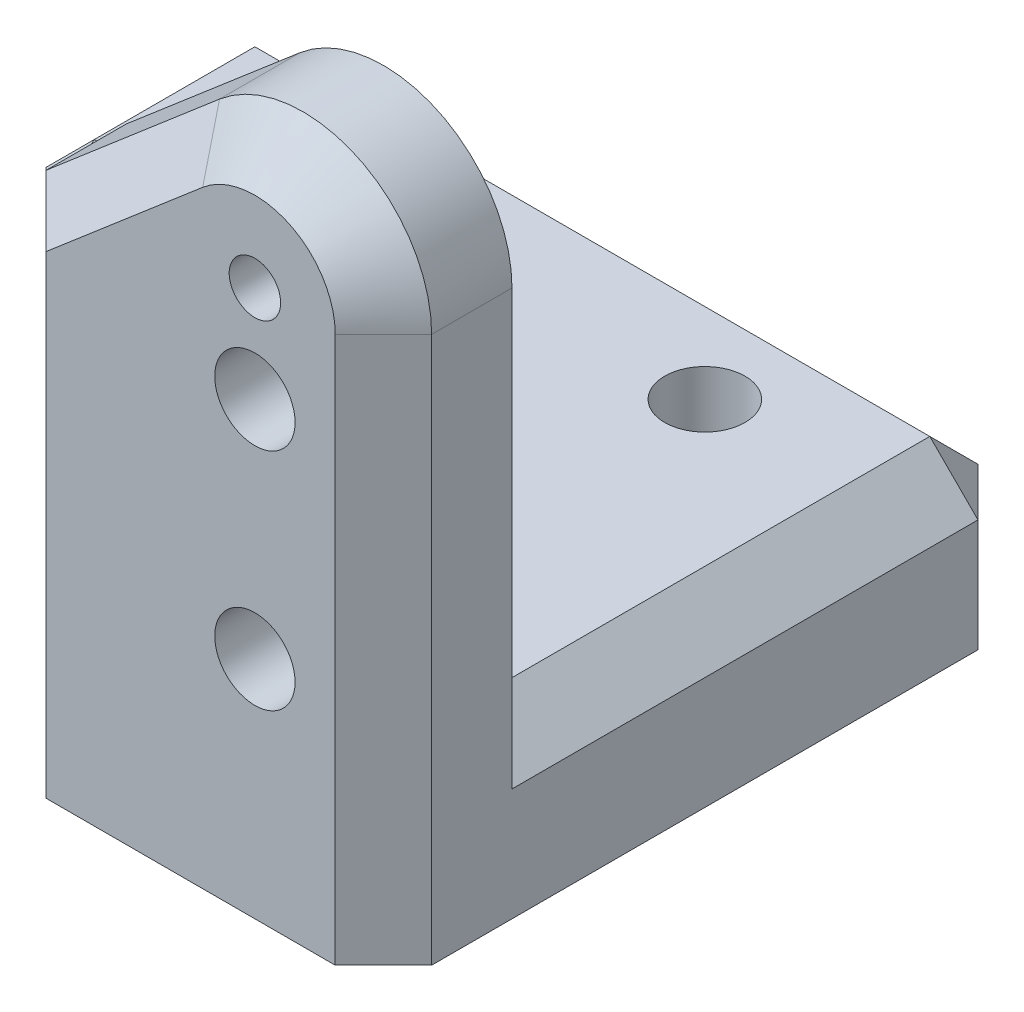
ISO-10303-21;
HEADER;
FILE_DESCRIPTION(('STEP AP214'),'2;1');
FILE_NAME('part.step','',(''),(''),'','','');
FILE_SCHEMA(('AUTOMOTIVE_DESIGN { 1 0 10303 214 1 1 1 1 }'));
ENDSEC;
DATA;
#1=APPLICATION_CONTEXT('core data for automotive mechanical design processes');
#2=APPLICATION_PROTOCOL_DEFINITION('international standard','automotive_design',2000,#1);
#3=PRODUCT_CONTEXT('',#1,'mechanical');
#4=PRODUCT('Part','Part','',(#3));
#5=PRODUCT_RELATED_PRODUCT_CATEGORY('part','',(#4));
#6=PRODUCT_DEFINITION_FORMATION('','',#4);
#7=PRODUCT_DEFINITION_CONTEXT('part definition',#1,'design');
#8=PRODUCT_DEFINITION('design','',#6,#7);
#9=PRODUCT_DEFINITION_SHAPE('','',#8);
#10=(LENGTH_UNIT() NAMED_UNIT(*) SI_UNIT(.MILLI.,.METRE.));
#11=(NAMED_UNIT(*) PLANE_ANGLE_UNIT() SI_UNIT($,.RADIAN.));
#12=(NAMED_UNIT(*) SI_UNIT($,.STERADIAN.) SOLID_ANGLE_UNIT());
#13=UNCERTAINTY_MEASURE_WITH_UNIT(LENGTH_MEASURE(1.E-05),#10,'distance_accuracy_value','');
#14=(GEOMETRIC_REPRESENTATION_CONTEXT(3) GLOBAL_UNCERTAINTY_ASSIGNED_CONTEXT((#13)) GLOBAL_UNIT_ASSIGNED_CONTEXT((#10,
#11,#12)) REPRESENTATION_CONTEXT('',''));
#15=CARTESIAN_POINT('',(0.,0.,0.));
#16=DIRECTION('',(0.,0.,1.));
#17=DIRECTION('',(1.,0.,0.));
#18=AXIS2_PLACEMENT_3D('',#15,#16,#17);
#19=CARTESIAN_POINT('',(-4.,5.,0.));
#20=DIRECTION('',(0.,-1.,0.));
#21=DIRECTION('',(0.,0.,-1.));
#22=AXIS2_PLACEMENT_3D('',#19,#20,#21);
#23=PLANE('',#22);
#24=CARTESIAN_POINT('',(-2.,5.,4.00000000000001));
#25=DIRECTION('',(0.,-1.,0.));
#26=DIRECTION('',(0.,0.,-1.));
#27=AXIS2_PLACEMENT_3D('',#24,#25,#26);
#28=CIRCLE('',#27,1.25);
#29=CARTESIAN_POINT('',(-2.,5.,2.75000000000001));
#30=VERTEX_POINT('',#29);
#31=EDGE_CURVE('E939',#30,#30,#28,.T.);
#32=ORIENTED_EDGE('',*,*,#31,.T.);
#33=EDGE_LOOP('',(#32));
#34=FACE_BOUND('',#33,.T.);
#35=CARTESIAN_POINT('',(10.,5.,4.00000000000001));
#36=DIRECTION('',(0.,-1.,0.));
#37=DIRECTION('',(0.,0.,-1.));
#38=AXIS2_PLACEMENT_3D('',#35,#36,#37);
#39=CIRCLE('',#38,1.25);
#40=CARTESIAN_POINT('',(10.,5.,2.75000000000001));
#41=VERTEX_POINT('',#40);
#42=EDGE_CURVE('E946',#41,#41,#39,.T.);
#43=ORIENTED_EDGE('',*,*,#42,.T.);
#44=EDGE_LOOP('',(#43));
#45=FACE_BOUND('',#44,.T.);
#46=CARTESIAN_POINT('',(10.,5.,14.));
#47=DIRECTION('',(0.,-1.,0.));
#48=DIRECTION('',(0.,0.,-1.));
#49=AXIS2_PLACEMENT_3D('',#46,#47,#48);
#50=CIRCLE('',#49,1.25);
#51=CARTESIAN_POINT('',(10.,5.,12.75));
#52=VERTEX_POINT('',#51);
#53=EDGE_CURVE('E273',#52,#52,#50,.T.);
#54=ORIENTED_EDGE('',*,*,#53,.T.);
#55=EDGE_LOOP('',(#54));
#56=FACE_BOUND('',#55,.T.);
#57=DIRECTION('',(1.,0.,0.));
#58=VECTOR('',#57,1.);
#59=CARTESIAN_POINT('',(-4.,5.,16.));
#60=LINE('',#59,#58);
#61=CARTESIAN_POINT('',(5.50000000000001,5.,16.));
#62=VERTEX_POINT('',#61);
#63=CARTESIAN_POINT('',(14.5,5.,16.));
#64=VERTEX_POINT('',#63);
#65=EDGE_CURVE('E347',#62,#64,#60,.T.);
#66=ORIENTED_EDGE('',*,*,#65,.T.);
#67=DIRECTION('',(0.,0.,-1.));
#68=VECTOR('',#67,1.);
#69=CARTESIAN_POINT('',(14.5,5.,0.));
#70=LINE('',#69,#68);
#71=CARTESIAN_POINT('',(14.5,5.,1.5));
#72=VERTEX_POINT('',#71);
#73=EDGE_CURVE('E212',#64,#72,#70,.T.);
#74=ORIENTED_EDGE('',*,*,#73,.T.);
#75=DIRECTION('',(-1.,0.,0.));
#76=VECTOR('',#75,1.);
#77=CARTESIAN_POINT('',(-8.,5.,1.5));
#78=LINE('',#77,#76);
#79=CARTESIAN_POINT('',(-6.50000000000001,5.,1.5));
#80=VERTEX_POINT('',#79);
#81=EDGE_CURVE('E209',#72,#80,#78,.T.);
#82=ORIENTED_EDGE('',*,*,#81,.T.);
#83=DIRECTION('',(0.,0.,1.));
#84=VECTOR('',#83,1.);
#85=CARTESIAN_POINT('',(-6.50000000000001,5.,0.));
#86=LINE('',#85,#84);
#87=CARTESIAN_POINT('',(-6.50000000000001,5.,6.50000000000001));
#88=VERTEX_POINT('',#87);
#89=EDGE_CURVE('E206',#80,#88,#86,.T.);
#90=ORIENTED_EDGE('',*,*,#89,.T.);
#91=DIRECTION('',(1.,0.,0.));
#92=VECTOR('',#91,1.);
#93=CARTESIAN_POINT('',(-4.,5.,6.50000000000001));
#94=LINE('',#93,#92);
#95=CARTESIAN_POINT('',(2.5,5.,6.50000000000001));
#96=VERTEX_POINT('',#95);
#97=EDGE_CURVE('E186',#88,#96,#94,.T.);
#98=ORIENTED_EDGE('',*,*,#97,.T.);
#99=DIRECTION('',(-0.707106781186551,0.,-0.707106781186544));
#100=VECTOR('',#99,1.);
#101=CARTESIAN_POINT('',(2.5,5.,6.50000000000001));
#102=LINE('',#101,#100);
#103=CARTESIAN_POINT('',(4.,5.,8.));
#104=VERTEX_POINT('',#103);
#105=EDGE_CURVE('E180',#104,#96,#102,.T.);
#106=ORIENTED_EDGE('',*,*,#105,.F.);
#107=DIRECTION('',(-0.707106781186551,0.,-0.707106781186544));
#108=VECTOR('',#107,1.);
#109=CARTESIAN_POINT('',(2.5,5.,6.50000000000001));
#110=LINE('',#109,#108);
#111=CARTESIAN_POINT('',(5.50000000000001,5.,9.49999999999999));
#112=VERTEX_POINT('',#111);
#113=EDGE_CURVE('E183',#112,#104,#110,.T.);
#114=ORIENTED_EDGE('',*,*,#113,.F.);
#115=DIRECTION('',(0.,0.,1.));
#116=VECTOR('',#115,1.);
#117=CARTESIAN_POINT('',(5.50000000000001,5.,0.));
#118=LINE('',#117,#116);
#119=EDGE_CURVE('E197',#112,#62,#118,.T.);
#120=ORIENTED_EDGE('',*,*,#119,.T.);
#121=EDGE_LOOP('',(#66,#74,#82,#90,#98,#106,#114,#120));
#122=FACE_BOUND('',#121,.T.);
#123=ADVANCED_FACE('F45',(#34,#45,#56,#122),#23,.F.);
#124=CARTESIAN_POINT('',(4.,0.,0.));
#125=DIRECTION('',(1.,0.,0.));
#126=DIRECTION('',(0.,0.,-1.));
#127=AXIS2_PLACEMENT_3D('',#124,#125,#126);
#128=PLANE('',#127);
#129=DIRECTION('',(0.,1.,0.));
#130=VECTOR('',#129,1.);
#131=CARTESIAN_POINT('',(4.,5.,16.));
#132=LINE('',#131,#130);
#133=CARTESIAN_POINT('',(4.,3.50000000000001,16.));
#134=VERTEX_POINT('',#133);
#135=CARTESIAN_POINT('',(4.,15.4211646096066,16.));
#136=VERTEX_POINT('',#135);
#137=EDGE_CURVE('E64',#134,#136,#132,.T.);
#138=ORIENTED_EDGE('',*,*,#137,.F.);
#139=DIRECTION('',(0.,0.,-1.));
#140=VECTOR('',#139,1.);
#141=CARTESIAN_POINT('',(4.,3.50000000000001,0.));
#142=LINE('',#141,#140);
#143=CARTESIAN_POINT('',(4.,3.50000000000001,9.49999999999999));
#144=VERTEX_POINT('',#143);
#145=EDGE_CURVE('E69',#134,#144,#142,.T.);
#146=ORIENTED_EDGE('',*,*,#145,.T.);
#147=DIRECTION('',(0.,-1.,0.));
#148=VECTOR('',#147,1.);
#149=CARTESIAN_POINT('',(4.,0.,9.49999999999999));
#150=LINE('',#149,#148);
#151=CARTESIAN_POINT('',(4.,0.,9.49999999999999));
#152=VERTEX_POINT('',#151);
#153=EDGE_CURVE('E259',#144,#152,#150,.T.);
#154=ORIENTED_EDGE('',*,*,#153,.T.);
#155=DIRECTION('',(0.,0.,1.));
#156=VECTOR('',#155,1.);
#157=CARTESIAN_POINT('',(4.,0.,0.));
#158=LINE('',#157,#156);
#159=CARTESIAN_POINT('',(4.,0.,18.5));
#160=VERTEX_POINT('',#159);
#161=EDGE_CURVE('E338',#152,#160,#158,.T.);
#162=ORIENTED_EDGE('',*,*,#161,.T.);
#163=DIRECTION('',(0.,1.,0.));
#164=VECTOR('',#163,1.);
#165=CARTESIAN_POINT('',(4.,0.,18.5));
#166=LINE('',#165,#164);
#167=CARTESIAN_POINT('',(4.,15.4211646096066,18.5));
#168=VERTEX_POINT('',#167);
#169=EDGE_CURVE('E200',#160,#168,#166,.T.);
#170=ORIENTED_EDGE('',*,*,#169,.T.);
#171=DIRECTION('',(0.,0.,1.));
#172=VECTOR('',#171,1.);
#173=CARTESIAN_POINT('',(4.,15.4211646096066,0.));
#174=LINE('',#173,#172);
#175=EDGE_CURVE('E334',#136,#168,#174,.T.);
#176=ORIENTED_EDGE('',*,*,#175,.F.);
#177=EDGE_LOOP('',(#138,#146,#154,#162,#170,#176));
#178=FACE_BOUND('',#177,.T.);
#179=ADVANCED_FACE('F458',(#178),#128,.F.);
#180=CARTESIAN_POINT('',(16.,0.,20.));
#181=DIRECTION('',(0.,1.,0.));
#182=DIRECTION('',(0.,0.,1.));
#183=AXIS2_PLACEMENT_3D('',#180,#181,#182);
#184=PLANE('',#183);
#185=CARTESIAN_POINT('',(-2.,0.,4.00000000000001));
#186=DIRECTION('',(0.,-1.,0.));
#187=DIRECTION('',(0.,0.,-1.));
#188=AXIS2_PLACEMENT_3D('',#185,#186,#187);
#189=CIRCLE('',#188,1.25);
#190=CARTESIAN_POINT('',(-2.,0.,2.75000000000001));
#191=VERTEX_POINT('',#190);
#192=EDGE_CURVE('E935',#191,#191,#189,.T.);
#193=ORIENTED_EDGE('',*,*,#192,.F.);
#194=EDGE_LOOP('',(#193));
#195=FACE_BOUND('',#194,.T.);
#196=CARTESIAN_POINT('',(10.,0.,4.00000000000001));
#197=DIRECTION('',(0.,-1.,0.));
#198=DIRECTION('',(0.,0.,-1.));
#199=AXIS2_PLACEMENT_3D('',#196,#197,#198);
#200=CIRCLE('',#199,1.25);
#201=CARTESIAN_POINT('',(10.,0.,2.75000000000001));
#202=VERTEX_POINT('',#201);
#203=EDGE_CURVE('E942',#202,#202,#200,.T.);
#204=ORIENTED_EDGE('',*,*,#203,.F.);
#205=EDGE_LOOP('',(#204));
#206=FACE_BOUND('',#205,.T.);
#207=CARTESIAN_POINT('',(10.,0.,14.));
#208=DIRECTION('',(0.,-1.,0.));
#209=DIRECTION('',(0.,0.,-1.));
#210=AXIS2_PLACEMENT_3D('',#207,#208,#209);
#211=CIRCLE('',#210,1.25);
#212=CARTESIAN_POINT('',(10.,0.,12.75));
#213=VERTEX_POINT('',#212);
#214=EDGE_CURVE('E949',#213,#213,#211,.T.);
#215=ORIENTED_EDGE('',*,*,#214,.F.);
#216=EDGE_LOOP('',(#215));
#217=FACE_BOUND('',#216,.T.);
#218=DIRECTION('',(1.,0.,0.));
#219=VECTOR('',#218,1.);
#220=CARTESIAN_POINT('',(16.,0.,0.));
#221=LINE('',#220,#219);
#222=CARTESIAN_POINT('',(-6.50000000000001,0.,0.));
#223=VERTEX_POINT('',#222);
#224=CARTESIAN_POINT('',(14.5,0.,0.));
#225=VERTEX_POINT('',#224);
#226=EDGE_CURVE('E358',#223,#225,#221,.T.);
#227=ORIENTED_EDGE('',*,*,#226,.T.);
#228=DIRECTION('',(0.707106781186544,0.,0.707106781186551));
#229=VECTOR('',#228,1.);
#230=CARTESIAN_POINT('',(16.,0.,1.5));
#231=LINE('',#230,#229);
#232=CARTESIAN_POINT('',(16.,0.,1.5));
#233=VERTEX_POINT('',#232);
#234=EDGE_CURVE('E238',#225,#233,#231,.T.);
#235=ORIENTED_EDGE('',*,*,#234,.T.);
#236=DIRECTION('',(0.,0.,-1.));
#237=VECTOR('',#236,1.);
#238=CARTESIAN_POINT('',(16.,0.,20.));
#239=LINE('',#238,#237);
#240=CARTESIAN_POINT('',(16.,0.,18.5));
#241=VERTEX_POINT('',#240);
#242=EDGE_CURVE('E372',#241,#233,#239,.T.);
#243=ORIENTED_EDGE('',*,*,#242,.F.);
#244=DIRECTION('',(0.707106781186549,0.,-0.707106781186546));
#245=VECTOR('',#244,1.);
#246=CARTESIAN_POINT('',(14.5,0.,20.));
#247=LINE('',#246,#245);
#248=CARTESIAN_POINT('',(14.5,0.,20.));
#249=VERTEX_POINT('',#248);
#250=EDGE_CURVE('E396',#241,#249,#247,.F.);
#251=ORIENTED_EDGE('',*,*,#250,.T.);
#252=DIRECTION('',(1.,0.,0.));
#253=VECTOR('',#252,1.);
#254=CARTESIAN_POINT('',(16.,0.,20.));
#255=LINE('',#254,#253);
#256=CARTESIAN_POINT('',(5.50000000000001,0.,20.));
#257=VERTEX_POINT('',#256);
#258=EDGE_CURVE('E359',#257,#249,#255,.T.);
#259=ORIENTED_EDGE('',*,*,#258,.F.);
#260=DIRECTION('',(0.707106781186549,0.,0.707106781186546));
#261=VECTOR('',#260,1.);
#262=CARTESIAN_POINT('',(4.,0.,18.5));
#263=LINE('',#262,#261);
#264=EDGE_CURVE('E392',#257,#160,#263,.F.);
#265=ORIENTED_EDGE('',*,*,#264,.T.);
#266=ORIENTED_EDGE('',*,*,#161,.F.);
#267=DIRECTION('',(0.707106781186551,0.,0.707106781186544));
#268=VECTOR('',#267,1.);
#269=CARTESIAN_POINT('',(15.2500000000001,0.,20.75));
#270=LINE('',#269,#268);
#271=CARTESIAN_POINT('',(2.5,0.,8.));
#272=VERTEX_POINT('',#271);
#273=EDGE_CURVE('E11',#152,#272,#270,.F.);
#274=ORIENTED_EDGE('',*,*,#273,.T.);
#275=DIRECTION('',(1.,0.,0.));
#276=VECTOR('',#275,1.);
#277=CARTESIAN_POINT('',(-8.,0.,8.));
#278=LINE('',#277,#276);
#279=CARTESIAN_POINT('',(-6.5,0.,8.));
#280=VERTEX_POINT('',#279);
#281=EDGE_CURVE('E314',#280,#272,#278,.T.);
#282=ORIENTED_EDGE('',*,*,#281,.F.);
#283=DIRECTION('',(0.707106781186551,0.,0.707106781186544));
#284=VECTOR('',#283,1.);
#285=CARTESIAN_POINT('',(-8.,0.,6.50000000000001));
#286=LINE('',#285,#284);
#287=CARTESIAN_POINT('',(-8.,0.,6.50000000000001));
#288=VERTEX_POINT('',#287);
#289=EDGE_CURVE('E232',#280,#288,#286,.F.);
#290=ORIENTED_EDGE('',*,*,#289,.T.);
#291=DIRECTION('',(0.,0.,1.));
#292=VECTOR('',#291,1.);
#293=CARTESIAN_POINT('',(-8.,0.,8.));
#294=LINE('',#293,#292);
#295=CARTESIAN_POINT('',(-8.,0.,1.5));
#296=VERTEX_POINT('',#295);
#297=EDGE_CURVE('E311',#296,#288,#294,.T.);
#298=ORIENTED_EDGE('',*,*,#297,.F.);
#299=DIRECTION('',(0.707106781186544,0.,-0.707106781186551));
#300=VECTOR('',#299,1.);
#301=CARTESIAN_POINT('',(-8.,0.,1.5));
#302=LINE('',#301,#300);
#303=EDGE_CURVE('E235',#296,#223,#302,.T.);
#304=ORIENTED_EDGE('',*,*,#303,.T.);
#305=EDGE_LOOP('',(#227,#235,#243,#251,#259,#265,#266,#274,#282,#290,#298,#304));
#306=FACE_BOUND('',#305,.T.);
#307=ADVANCED_FACE('F430',(#195,#206,#217,#306),#184,.F.);
#308=CARTESIAN_POINT('',(16.,17.,20.));
#309=DIRECTION('',(-1.,0.,0.));
#310=DIRECTION('',(0.,0.,1.));
#311=AXIS2_PLACEMENT_3D('',#308,#309,#310);
#312=PLANE('',#311);
#313=DIRECTION('',(0.,0.,1.));
#314=VECTOR('',#313,1.);
#315=CARTESIAN_POINT('',(16.,3.50000000000001,20.));
#316=LINE('',#315,#314);
#317=CARTESIAN_POINT('',(16.,3.50000000000001,1.5));
#318=VERTEX_POINT('',#317);
#319=CARTESIAN_POINT('',(16.,3.50000000000001,16.));
#320=VERTEX_POINT('',#319);
#321=EDGE_CURVE('E219',#318,#320,#316,.T.);
#322=ORIENTED_EDGE('',*,*,#321,.T.);
#323=DIRECTION('',(0.,-1.,0.));
#324=VECTOR('',#323,1.);
#325=CARTESIAN_POINT('',(16.,5.,16.));
#326=LINE('',#325,#324);
#327=CARTESIAN_POINT('',(16.,17.,16.));
#328=VERTEX_POINT('',#327);
#329=EDGE_CURVE('E344',#328,#320,#326,.T.);
#330=ORIENTED_EDGE('',*,*,#329,.F.);
#331=DIRECTION('',(0.,0.,-1.));
#332=VECTOR('',#331,1.);
#333=CARTESIAN_POINT('',(16.,17.,20.));
#334=LINE('',#333,#332);
#335=CARTESIAN_POINT('',(16.,17.,18.5));
#336=VERTEX_POINT('',#335);
#337=EDGE_CURVE('E369',#336,#328,#334,.T.);
#338=ORIENTED_EDGE('',*,*,#337,.F.);
#339=DIRECTION('',(0.,-1.,0.));
#340=VECTOR('',#339,1.);
#341=CARTESIAN_POINT('',(16.,17.,18.5));
#342=LINE('',#341,#340);
#343=EDGE_CURVE('E389',#336,#241,#342,.T.);
#344=ORIENTED_EDGE('',*,*,#343,.T.);
#345=ORIENTED_EDGE('',*,*,#242,.T.);
#346=DIRECTION('',(0.,1.,0.));
#347=VECTOR('',#346,1.);
#348=CARTESIAN_POINT('',(16.,5.,1.5));
#349=LINE('',#348,#347);
#350=EDGE_CURVE('E216',#233,#318,#349,.T.);
#351=ORIENTED_EDGE('',*,*,#350,.T.);
#352=EDGE_LOOP('',(#322,#330,#338,#344,#345,#351));
#353=FACE_BOUND('',#352,.T.);
#354=ADVANCED_FACE('F449',(#353),#312,.F.);
#355=CARTESIAN_POINT('',(12.,17.,20.));
#356=DIRECTION('',(0.,0.,-1.));
#357=DIRECTION('',(-1.,0.,0.));
#358=AXIS2_PLACEMENT_3D('',#355,#356,#357);
#359=CYLINDRICAL_SURFACE('',#358,4.);
#360=DIRECTION('',(0.,0.,-1.));
#361=VECTOR('',#360,1.);
#362=CARTESIAN_POINT('',(9.40008084297598,20.0398059768577,20.));
#363=LINE('',#362,#361);
#364=CARTESIAN_POINT('',(9.40008084297598,20.0398059768577,18.5));
#365=VERTEX_POINT('',#364);
#366=CARTESIAN_POINT('',(9.40008084297598,20.0398059768577,16.));
#367=VERTEX_POINT('',#366);
#368=EDGE_CURVE('E363',#365,#367,#363,.T.);
#369=ORIENTED_EDGE('',*,*,#368,.F.);
#370=CARTESIAN_POINT('',(12.,17.,18.5));
#371=DIRECTION('',(0.,0.,-1.));
#372=DIRECTION('',(-1.,0.,0.));
#373=AXIS2_PLACEMENT_3D('',#370,#371,#372);
#374=CIRCLE('',#373,4.);
#375=EDGE_CURVE('E399',#365,#336,#374,.T.);
#376=ORIENTED_EDGE('',*,*,#375,.T.);
#377=ORIENTED_EDGE('',*,*,#337,.T.);
#378=CARTESIAN_POINT('',(12.,17.,16.));
#379=DIRECTION('',(0.,0.,1.));
#380=DIRECTION('',(1.,0.,0.));
#381=AXIS2_PLACEMENT_3D('',#378,#379,#380);
#382=CIRCLE('',#381,4.);
#383=EDGE_CURVE('E354',#328,#367,#382,.T.);
#384=ORIENTED_EDGE('',*,*,#383,.T.);
#385=EDGE_LOOP('',(#369,#376,#377,#384));
#386=FACE_BOUND('',#385,.T.);
#387=ADVANCED_FACE('F445',(#386),#359,.T.);
#388=CARTESIAN_POINT('',(0.,12.,20.));
#389=DIRECTION('',(0.649979789256005,-0.759951494214413,0.));
#390=DIRECTION('',(0.759951494214413,0.649979789256005,0.));
#391=AXIS2_PLACEMENT_3D('',#388,#389,#390);
#392=PLANE('',#391);
#393=ORIENTED_EDGE('',*,*,#175,.T.);
#394=DIRECTION('',(0.759951494214413,0.649979789256005,0.));
#395=VECTOR('',#394,1.);
#396=CARTESIAN_POINT('',(0.,12.,18.5));
#397=LINE('',#396,#395);
#398=EDGE_CURVE('E402',#168,#365,#397,.T.);
#399=ORIENTED_EDGE('',*,*,#398,.T.);
#400=ORIENTED_EDGE('',*,*,#368,.T.);
#401=DIRECTION('',(-0.759951494214413,-0.649979789256005,0.));
#402=VECTOR('',#401,1.);
#403=CARTESIAN_POINT('',(0.,12.,16.));
#404=LINE('',#403,#402);
#405=EDGE_CURVE('E350',#367,#136,#404,.T.);
#406=ORIENTED_EDGE('',*,*,#405,.T.);
#407=EDGE_LOOP('',(#393,#399,#400,#406));
#408=FACE_BOUND('',#407,.T.);
#409=ADVANCED_FACE('F457',(#408),#392,.F.);
#410=CARTESIAN_POINT('',(12.,17.,20.));
#411=DIRECTION('',(0.,0.,-1.));
#412=DIRECTION('',(-1.,0.,0.));
#413=AXIS2_PLACEMENT_3D('',#410,#411,#412);
#414=PLANE('',#413);
#415=CARTESIAN_POINT('',(12.,7.,20.));
#416=DIRECTION('',(0.,0.,1.));
#417=DIRECTION('',(1.,0.,0.));
#418=AXIS2_PLACEMENT_3D('',#415,#416,#417);
#419=CIRCLE('',#418,1.25);
#420=CARTESIAN_POINT('',(13.25,7.,20.));
#421=VERTEX_POINT('',#420);
#422=EDGE_CURVE('E921',#421,#421,#419,.T.);
#423=ORIENTED_EDGE('',*,*,#422,.F.);
#424=EDGE_LOOP('',(#423));
#425=FACE_BOUND('',#424,.T.);
#426=CARTESIAN_POINT('',(12.,14.,20.));
#427=DIRECTION('',(0.,0.,1.));
#428=DIRECTION('',(1.,0.,0.));
#429=AXIS2_PLACEMENT_3D('',#426,#427,#428);
#430=CIRCLE('',#429,1.25);
#431=CARTESIAN_POINT('',(13.25,14.,20.));
#432=VERTEX_POINT('',#431);
#433=EDGE_CURVE('E925',#432,#432,#430,.T.);
#434=ORIENTED_EDGE('',*,*,#433,.F.);
#435=EDGE_LOOP('',(#434));
#436=FACE_BOUND('',#435,.T.);
#437=CARTESIAN_POINT('',(12.,17.,20.));
#438=DIRECTION('',(0.,0.,1.));
#439=DIRECTION('',(1.,0.,0.));
#440=AXIS2_PLACEMENT_3D('',#437,#438,#439);
#441=CIRCLE('',#440,0.799999999999997);
#442=CARTESIAN_POINT('',(12.8,17.,20.));
#443=VERTEX_POINT('',#442);
#444=EDGE_CURVE('E321',#443,#443,#441,.T.);
#445=ORIENTED_EDGE('',*,*,#444,.F.);
#446=EDGE_LOOP('',(#445));
#447=FACE_BOUND('',#446,.T.);
#448=ORIENTED_EDGE('',*,*,#258,.T.);
#449=DIRECTION('',(0.,1.,0.));
#450=VECTOR('',#449,1.);
#451=CARTESIAN_POINT('',(14.5,17.,20.));
#452=LINE('',#451,#450);
#453=CARTESIAN_POINT('',(14.5,17.,20.));
#454=VERTEX_POINT('',#453);
#455=EDGE_CURVE('E385',#249,#454,#452,.T.);
#456=ORIENTED_EDGE('',*,*,#455,.T.);
#457=CARTESIAN_POINT('',(12.,17.,20.));
#458=DIRECTION('',(0.,0.,-1.));
#459=DIRECTION('',(-1.,0.,0.));
#460=AXIS2_PLACEMENT_3D('',#457,#458,#459);
#461=CIRCLE('',#460,2.49999999999999);
#462=CARTESIAN_POINT('',(10.37505052686,18.899878735536,20.));
#463=VERTEX_POINT('',#462);
#464=EDGE_CURVE('E382',#454,#463,#461,.F.);
#465=ORIENTED_EDGE('',*,*,#464,.T.);
#466=DIRECTION('',(-0.759951494214413,-0.649979789256005,0.));
#467=VECTOR('',#466,1.);
#468=CARTESIAN_POINT('',(10.37505052686,18.899878735536,20.));
#469=LINE('',#468,#467);
#470=CARTESIAN_POINT('',(5.50000000000001,14.7302911524017,20.));
#471=VERTEX_POINT('',#470);
#472=EDGE_CURVE('E379',#463,#471,#469,.T.);
#473=ORIENTED_EDGE('',*,*,#472,.T.);
#474=DIRECTION('',(0.,-1.,0.));
#475=VECTOR('',#474,1.);
#476=CARTESIAN_POINT('',(5.50000000000001,17.,20.));
#477=LINE('',#476,#475);
#478=EDGE_CURVE('E376',#471,#257,#477,.T.);
#479=ORIENTED_EDGE('',*,*,#478,.T.);
#480=EDGE_LOOP('',(#448,#456,#465,#473,#479));
#481=FACE_BOUND('',#480,.T.);
#482=ADVANCED_FACE('F427',(#425,#436,#447,#481),#414,.F.);
#483=CARTESIAN_POINT('',(12.,17.,0.));
#484=DIRECTION('',(0.,0.,-1.));
#485=DIRECTION('',(-1.,0.,0.));
#486=AXIS2_PLACEMENT_3D('',#483,#484,#485);
#487=PLANE('',#486);
#488=DIRECTION('',(1.,0.,0.));
#489=VECTOR('',#488,1.);
#490=CARTESIAN_POINT('',(16.,3.50000000000001,0.));
#491=LINE('',#490,#489);
#492=CARTESIAN_POINT('',(-6.50000000000001,3.50000000000001,0.));
#493=VERTEX_POINT('',#492);
#494=CARTESIAN_POINT('',(14.5,3.50000000000001,0.));
#495=VERTEX_POINT('',#494);
#496=EDGE_CURVE('E226',#493,#495,#491,.T.);
#497=ORIENTED_EDGE('',*,*,#496,.T.);
#498=DIRECTION('',(0.,-1.,0.));
#499=VECTOR('',#498,1.);
#500=CARTESIAN_POINT('',(14.5,0.,0.));
#501=LINE('',#500,#499);
#502=EDGE_CURVE('E229',#495,#225,#501,.T.);
#503=ORIENTED_EDGE('',*,*,#502,.T.);
#504=ORIENTED_EDGE('',*,*,#226,.F.);
#505=DIRECTION('',(0.,1.,0.));
#506=VECTOR('',#505,1.);
#507=CARTESIAN_POINT('',(-6.50000000000001,5.,0.));
#508=LINE('',#507,#506);
#509=EDGE_CURVE('E223',#223,#493,#508,.T.);
#510=ORIENTED_EDGE('',*,*,#509,.T.);
#511=EDGE_LOOP('',(#497,#503,#504,#510));
#512=FACE_BOUND('',#511,.T.);
#513=ADVANCED_FACE('F496',(#512),#487,.T.);
#514=CARTESIAN_POINT('',(-4.,5.,16.));
#515=DIRECTION('',(0.,0.,1.));
#516=DIRECTION('',(1.,0.,0.));
#517=AXIS2_PLACEMENT_3D('',#514,#515,#516);
#518=PLANE('',#517);
#519=CARTESIAN_POINT('',(12.,7.,16.));
#520=DIRECTION('',(0.,0.,1.));
#521=DIRECTION('',(1.,0.,0.));
#522=AXIS2_PLACEMENT_3D('',#519,#520,#521);
#523=CIRCLE('',#522,1.25);
#524=CARTESIAN_POINT('',(13.25,7.,16.));
#525=VERTEX_POINT('',#524);
#526=EDGE_CURVE('E918',#525,#525,#523,.T.);
#527=ORIENTED_EDGE('',*,*,#526,.T.);
#528=EDGE_LOOP('',(#527));
#529=FACE_BOUND('',#528,.T.);
#530=CARTESIAN_POINT('',(12.,14.,16.));
#531=DIRECTION('',(0.,0.,1.));
#532=DIRECTION('',(1.,0.,0.));
#533=AXIS2_PLACEMENT_3D('',#530,#531,#532);
#534=CIRCLE('',#533,1.25);
#535=CARTESIAN_POINT('',(13.25,14.,16.));
#536=VERTEX_POINT('',#535);
#537=EDGE_CURVE('E931',#536,#536,#534,.T.);
#538=ORIENTED_EDGE('',*,*,#537,.T.);
#539=EDGE_LOOP('',(#538));
#540=FACE_BOUND('',#539,.T.);
#541=CARTESIAN_POINT('',(12.,17.,16.));
#542=DIRECTION('',(0.,0.,1.));
#543=DIRECTION('',(1.,0.,0.));
#544=AXIS2_PLACEMENT_3D('',#541,#542,#543);
#545=CIRCLE('',#544,0.799999999999996);
#546=CARTESIAN_POINT('',(12.8,17.,16.));
#547=VERTEX_POINT('',#546);
#548=EDGE_CURVE('E329',#547,#547,#545,.T.);
#549=ORIENTED_EDGE('',*,*,#548,.T.);
#550=EDGE_LOOP('',(#549));
#551=FACE_BOUND('',#550,.T.);
#552=ORIENTED_EDGE('',*,*,#65,.F.);
#553=DIRECTION('',(0.707106781186551,0.707106781186544,0.));
#554=VECTOR('',#553,1.);
#555=CARTESIAN_POINT('',(0.749999999999958,0.249999999999995,16.));
#556=LINE('',#555,#554);
#557=EDGE_CURVE('E56',#62,#134,#556,.F.);
#558=ORIENTED_EDGE('',*,*,#557,.T.);
#559=ORIENTED_EDGE('',*,*,#137,.T.);
#560=ORIENTED_EDGE('',*,*,#405,.F.);
#561=ORIENTED_EDGE('',*,*,#383,.F.);
#562=ORIENTED_EDGE('',*,*,#329,.T.);
#563=DIRECTION('',(0.707106781186551,-0.707106781186544,0.));
#564=VECTOR('',#563,1.);
#565=CARTESIAN_POINT('',(5.24999999999991,14.25,16.));
#566=LINE('',#565,#564);
#567=EDGE_CURVE('E264',#320,#64,#566,.F.);
#568=ORIENTED_EDGE('',*,*,#567,.T.);
#569=EDGE_LOOP('',(#552,#558,#559,#560,#561,#562,#568));
#570=FACE_BOUND('',#569,.T.);
#571=ADVANCED_FACE('F454',(#529,#540,#551,#570),#518,.F.);
#572=CARTESIAN_POINT('',(4.,0.,18.5));
#573=DIRECTION('',(0.707106781186546,0.,-0.707106781186549));
#574=DIRECTION('',(0.,1.,0.));
#575=AXIS2_PLACEMENT_3D('',#572,#573,#574);
#576=PLANE('',#575);
#577=ORIENTED_EDGE('',*,*,#264,.F.);
#578=ORIENTED_EDGE('',*,*,#478,.F.);
#579=DIRECTION('',(-0.67234794595281,0.309671566576716,-0.672347945952807));
#580=VECTOR('',#579,1.);
#581=CARTESIAN_POINT('',(7.2107950630559,13.9423292192132,21.7107950630559));
#582=LINE('',#581,#580);
#583=EDGE_CURVE('E341',#168,#471,#582,.F.);
#584=ORIENTED_EDGE('',*,*,#583,.F.);
#585=ORIENTED_EDGE('',*,*,#169,.F.);
#586=EDGE_LOOP('',(#577,#578,#584,#585));
#587=FACE_BOUND('',#586,.T.);
#588=ADVANCED_FACE('F424',(#587),#576,.F.);
#589=CARTESIAN_POINT('',(10.37505052686,18.899878735536,20.));
#590=DIRECTION('',(0.459605116617124,-0.53736685493186,-0.707106781186549));
#591=DIRECTION('',(-0.759951494214413,-0.649979789256005,0.));
#592=AXIS2_PLACEMENT_3D('',#589,#590,#591);
#593=PLANE('',#592);
#594=ORIENTED_EDGE('',*,*,#583,.T.);
#595=ORIENTED_EDGE('',*,*,#472,.F.);
#596=DIRECTION('',(0.459605116617125,-0.537366854931862,0.707106781186546));
#597=VECTOR('',#596,1.);
#598=CARTESIAN_POINT('',(9.40008084297598,20.0398059768577,18.5));
#599=LINE('',#598,#597);
#600=EDGE_CURVE('E409',#365,#463,#599,.T.);
#601=ORIENTED_EDGE('',*,*,#600,.F.);
#602=ORIENTED_EDGE('',*,*,#398,.F.);
#603=EDGE_LOOP('',(#594,#595,#601,#602));
#604=FACE_BOUND('',#603,.T.);
#605=ADVANCED_FACE('F418',(#604),#593,.F.);
#606=CARTESIAN_POINT('',(12.,17.,20.));
#607=DIRECTION('',(0.,0.,-1.));
#608=DIRECTION('',(-1.,0.,0.));
#609=AXIS2_PLACEMENT_3D('',#606,#607,#608);
#610=CONICAL_SURFACE('',#609,2.49999999999999,0.78539816339745);
#611=ORIENTED_EDGE('',*,*,#600,.T.);
#612=ORIENTED_EDGE('',*,*,#464,.F.);
#613=DIRECTION('',(-0.707106781186549,0.,0.707106781186546));
#614=VECTOR('',#613,1.);
#615=CARTESIAN_POINT('',(16.,17.,18.5));
#616=LINE('',#615,#614);
#617=EDGE_CURVE('E333',#336,#454,#616,.T.);
#618=ORIENTED_EDGE('',*,*,#617,.F.);
#619=ORIENTED_EDGE('',*,*,#375,.F.);
#620=EDGE_LOOP('',(#611,#612,#618,#619));
#621=FACE_BOUND('',#620,.T.);
#622=ADVANCED_FACE('F440',(#621),#610,.T.);
#623=CARTESIAN_POINT('',(14.5,17.,20.));
#624=DIRECTION('',(-0.707106781186546,0.,-0.707106781186549));
#625=DIRECTION('',(0.,1.,0.));
#626=AXIS2_PLACEMENT_3D('',#623,#624,#625);
#627=PLANE('',#626);
#628=ORIENTED_EDGE('',*,*,#250,.F.);
#629=ORIENTED_EDGE('',*,*,#343,.F.);
#630=ORIENTED_EDGE('',*,*,#617,.T.);
#631=ORIENTED_EDGE('',*,*,#455,.F.);
#632=EDGE_LOOP('',(#628,#629,#630,#631));
#633=FACE_BOUND('',#632,.T.);
#634=ADVANCED_FACE('F436',(#633),#627,.F.);
#635=CARTESIAN_POINT('',(12.,17.,20.));
#636=DIRECTION('',(0.,0.,1.));
#637=DIRECTION('',(1.,0.,0.));
#638=AXIS2_PLACEMENT_3D('',#635,#636,#637);
#639=CYLINDRICAL_SURFACE('',#638,0.799999999999996);
#640=ORIENTED_EDGE('',*,*,#444,.T.);
#641=EDGE_LOOP('',(#640));
#642=FACE_BOUND('',#641,.T.);
#643=ORIENTED_EDGE('',*,*,#548,.F.);
#644=EDGE_LOOP('',(#643));
#645=FACE_BOUND('',#644,.T.);
#646=ADVANCED_FACE('F551',(#642,#645),#639,.F.);
#647=CARTESIAN_POINT('',(-8.,5.,8.));
#648=DIRECTION('',(0.,0.,-1.));
#649=DIRECTION('',(-1.,0.,0.));
#650=AXIS2_PLACEMENT_3D('',#647,#648,#649);
#651=PLANE('',#650);
#652=DIRECTION('',(-1.,0.,0.));
#653=VECTOR('',#652,1.);
#654=CARTESIAN_POINT('',(-8.,3.49999999999999,8.));
#655=LINE('',#654,#653);
#656=CARTESIAN_POINT('',(2.5,3.49999999999999,8.));
#657=VERTEX_POINT('',#656);
#658=CARTESIAN_POINT('',(-6.5,3.49999999999999,8.));
#659=VERTEX_POINT('',#658);
#660=EDGE_CURVE('E253',#657,#659,#655,.T.);
#661=ORIENTED_EDGE('',*,*,#660,.T.);
#662=DIRECTION('',(0.,-1.,0.));
#663=VECTOR('',#662,1.);
#664=CARTESIAN_POINT('',(-6.5,5.,8.));
#665=LINE('',#664,#663);
#666=EDGE_CURVE('E256',#659,#280,#665,.T.);
#667=ORIENTED_EDGE('',*,*,#666,.T.);
#668=ORIENTED_EDGE('',*,*,#281,.T.);
#669=DIRECTION('',(0.,1.,0.));
#670=VECTOR('',#669,1.);
#671=CARTESIAN_POINT('',(2.5,5.,8.));
#672=LINE('',#671,#670);
#673=EDGE_CURVE('E250',#272,#657,#672,.T.);
#674=ORIENTED_EDGE('',*,*,#673,.T.);
#675=EDGE_LOOP('',(#661,#667,#668,#674));
#676=FACE_BOUND('',#675,.T.);
#677=ADVANCED_FACE('F465',(#676),#651,.F.);
#678=CARTESIAN_POINT('',(-8.,0.,0.));
#679=DIRECTION('',(1.,0.,0.));
#680=DIRECTION('',(0.,0.,-1.));
#681=AXIS2_PLACEMENT_3D('',#678,#679,#680);
#682=PLANE('',#681);
#683=DIRECTION('',(0.,0.,-1.));
#684=VECTOR('',#683,1.);
#685=CARTESIAN_POINT('',(-8.,3.5,0.));
#686=LINE('',#685,#684);
#687=CARTESIAN_POINT('',(-8.,3.49999999999999,6.50000000000001));
#688=VERTEX_POINT('',#687);
#689=CARTESIAN_POINT('',(-8.,3.49999999999999,1.5));
#690=VERTEX_POINT('',#689);
#691=EDGE_CURVE('E244',#688,#690,#686,.T.);
#692=ORIENTED_EDGE('',*,*,#691,.T.);
#693=DIRECTION('',(0.,-1.,0.));
#694=VECTOR('',#693,1.);
#695=CARTESIAN_POINT('',(-8.,0.,1.5));
#696=LINE('',#695,#694);
#697=EDGE_CURVE('E247',#690,#296,#696,.T.);
#698=ORIENTED_EDGE('',*,*,#697,.T.);
#699=ORIENTED_EDGE('',*,*,#297,.T.);
#700=DIRECTION('',(0.,1.,0.));
#701=VECTOR('',#700,1.);
#702=CARTESIAN_POINT('',(-8.,0.,6.50000000000001));
#703=LINE('',#702,#701);
#704=EDGE_CURVE('E241',#288,#688,#703,.T.);
#705=ORIENTED_EDGE('',*,*,#704,.T.);
#706=EDGE_LOOP('',(#692,#698,#699,#705));
#707=FACE_BOUND('',#706,.T.);
#708=ADVANCED_FACE('F474',(#707),#682,.F.);
#709=CARTESIAN_POINT('',(5.50000000000001,5.,0.));
#710=DIRECTION('',(0.707106781186544,-0.707106781186551,0.));
#711=DIRECTION('',(0.,0.,1.));
#712=AXIS2_PLACEMENT_3D('',#709,#710,#711);
#713=PLANE('',#712);
#714=ORIENTED_EDGE('',*,*,#557,.F.);
#715=ORIENTED_EDGE('',*,*,#119,.F.);
#716=DIRECTION('',(0.707106781186551,0.707106781186544,0.));
#717=VECTOR('',#716,1.);
#718=CARTESIAN_POINT('',(4.,3.50000000000001,9.49999999999999));
#719=LINE('',#718,#717);
#720=EDGE_CURVE('E50',#144,#112,#719,.T.);
#721=ORIENTED_EDGE('',*,*,#720,.F.);
#722=ORIENTED_EDGE('',*,*,#145,.F.);
#723=EDGE_LOOP('',(#714,#715,#721,#722));
#724=FACE_BOUND('',#723,.T.);
#725=ADVANCED_FACE('F48',(#724),#713,.F.);
#726=CARTESIAN_POINT('',(2.5,5.,8.));
#727=DIRECTION('',(-0.707106781186544,0.,0.707106781186551));
#728=DIRECTION('',(0.,-1.,0.));
#729=AXIS2_PLACEMENT_3D('',#726,#727,#728);
#730=PLANE('',#729);
#731=ORIENTED_EDGE('',*,*,#273,.F.);
#732=ORIENTED_EDGE('',*,*,#153,.F.);
#733=DIRECTION('',(-0.707106781186551,0.,-0.707106781186544));
#734=VECTOR('',#733,1.);
#735=CARTESIAN_POINT('',(2.5,3.49999999999999,8.));
#736=LINE('',#735,#734);
#737=EDGE_CURVE('E307',#657,#144,#736,.F.);
#738=ORIENTED_EDGE('',*,*,#737,.F.);
#739=ORIENTED_EDGE('',*,*,#673,.F.);
#740=EDGE_LOOP('',(#731,#732,#738,#739));
#741=FACE_BOUND('',#740,.T.);
#742=ADVANCED_FACE('F463',(#741),#730,.T.);
#743=CARTESIAN_POINT('',(2.5,3.49999999999999,8.));
#744=DIRECTION('',(-0.577350269189627,0.577350269189622,0.577350269189628));
#745=DIRECTION('',(0.707106781186548,0.,0.707106781186547));
#746=AXIS2_PLACEMENT_3D('',#743,#744,#745);
#747=PLANE('',#746);
#748=ORIENTED_EDGE('',*,*,#113,.T.);
#749=ORIENTED_EDGE('',*,*,#105,.T.);
#750=DIRECTION('',(0.,-0.707106781186551,0.707106781186544));
#751=VECTOR('',#750,1.);
#752=CARTESIAN_POINT('',(2.5,5.,6.50000000000001));
#753=LINE('',#752,#751);
#754=EDGE_CURVE('E305',#657,#96,#753,.F.);
#755=ORIENTED_EDGE('',*,*,#754,.F.);
#756=ORIENTED_EDGE('',*,*,#737,.T.);
#757=ORIENTED_EDGE('',*,*,#720,.T.);
#758=EDGE_LOOP('',(#748,#749,#755,#756,#757));
#759=FACE_BOUND('',#758,.T.);
#760=ADVANCED_FACE('F193',(#759),#747,.T.);
#761=CARTESIAN_POINT('',(-4.,5.,6.50000000000001));
#762=DIRECTION('',(0.,-0.707106781186544,-0.707106781186551));
#763=DIRECTION('',(1.,0.,0.));
#764=AXIS2_PLACEMENT_3D('',#761,#762,#763);
#765=PLANE('',#764);
#766=ORIENTED_EDGE('',*,*,#754,.T.);
#767=ORIENTED_EDGE('',*,*,#97,.F.);
#768=DIRECTION('',(0.,-0.707106781186551,0.707106781186544));
#769=VECTOR('',#768,1.);
#770=CARTESIAN_POINT('',(-6.50000000000001,5.,6.50000000000001));
#771=LINE('',#770,#769);
#772=EDGE_CURVE('E301',#659,#88,#771,.F.);
#773=ORIENTED_EDGE('',*,*,#772,.F.);
#774=ORIENTED_EDGE('',*,*,#660,.F.);
#775=EDGE_LOOP('',(#766,#767,#773,#774));
#776=FACE_BOUND('',#775,.T.);
#777=ADVANCED_FACE('F615',(#776),#765,.F.);
#778=CARTESIAN_POINT('',(-8.,0.,6.50000000000001));
#779=DIRECTION('',(0.707106781186544,0.,-0.707106781186551));
#780=DIRECTION('',(0.,1.,0.));
#781=AXIS2_PLACEMENT_3D('',#778,#779,#780);
#782=PLANE('',#781);
#783=ORIENTED_EDGE('',*,*,#289,.F.);
#784=ORIENTED_EDGE('',*,*,#666,.F.);
#785=DIRECTION('',(-0.707106781186551,0.,-0.707106781186544));
#786=VECTOR('',#785,1.);
#787=CARTESIAN_POINT('',(-7.25,3.49999999999999,7.25));
#788=LINE('',#787,#786);
#789=EDGE_CURVE('E297',#688,#659,#788,.F.);
#790=ORIENTED_EDGE('',*,*,#789,.F.);
#791=ORIENTED_EDGE('',*,*,#704,.F.);
#792=EDGE_LOOP('',(#783,#784,#790,#791));
#793=FACE_BOUND('',#792,.T.);
#794=ADVANCED_FACE('F470',(#793),#782,.F.);
#795=CARTESIAN_POINT('',(-6.50000000000001,5.,6.50000000000001));
#796=DIRECTION('',(-0.577350269189626,0.57735026918962,0.577350269189631));
#797=DIRECTION('',(0.707106781186551,0.,0.707106781186544));
#798=AXIS2_PLACEMENT_3D('',#795,#796,#797);
#799=PLANE('',#798);
#800=ORIENTED_EDGE('',*,*,#789,.T.);
#801=ORIENTED_EDGE('',*,*,#772,.T.);
#802=DIRECTION('',(0.707106781186544,0.707106781186551,0.));
#803=VECTOR('',#802,1.);
#804=CARTESIAN_POINT('',(-6.50000000000001,5.,6.50000000000001));
#805=LINE('',#804,#803);
#806=EDGE_CURVE('E293',#688,#88,#805,.T.);
#807=ORIENTED_EDGE('',*,*,#806,.F.);
#808=EDGE_LOOP('',(#800,#801,#807));
#809=FACE_BOUND('',#808,.T.);
#810=ADVANCED_FACE('F603',(#809),#799,.T.);
#811=CARTESIAN_POINT('',(-8.,3.5,0.));
#812=DIRECTION('',(0.707106781186551,-0.707106781186544,0.));
#813=DIRECTION('',(0.,0.,-1.));
#814=AXIS2_PLACEMENT_3D('',#811,#812,#813);
#815=PLANE('',#814);
#816=ORIENTED_EDGE('',*,*,#806,.T.);
#817=ORIENTED_EDGE('',*,*,#89,.F.);
#818=DIRECTION('',(-0.707106781186544,-0.707106781186551,0.));
#819=VECTOR('',#818,1.);
#820=CARTESIAN_POINT('',(-6.50000000000001,5.,1.5));
#821=LINE('',#820,#819);
#822=EDGE_CURVE('E289',#690,#80,#821,.F.);
#823=ORIENTED_EDGE('',*,*,#822,.F.);
#824=ORIENTED_EDGE('',*,*,#691,.F.);
#825=EDGE_LOOP('',(#816,#817,#823,#824));
#826=FACE_BOUND('',#825,.T.);
#827=ADVANCED_FACE('F486',(#826),#815,.F.);
#828=CARTESIAN_POINT('',(-8.,0.,1.5));
#829=DIRECTION('',(-0.707106781186551,0.,-0.707106781186544));
#830=DIRECTION('',(0.,1.,0.));
#831=AXIS2_PLACEMENT_3D('',#828,#829,#830);
#832=PLANE('',#831);
#833=ORIENTED_EDGE('',*,*,#303,.F.);
#834=ORIENTED_EDGE('',*,*,#697,.F.);
#835=DIRECTION('',(-0.707106781186544,0.,0.707106781186551));
#836=VECTOR('',#835,1.);
#837=CARTESIAN_POINT('',(-7.25000000000001,3.5,0.750000000000003));
#838=LINE('',#837,#836);
#839=EDGE_CURVE('E285',#493,#690,#838,.T.);
#840=ORIENTED_EDGE('',*,*,#839,.F.);
#841=ORIENTED_EDGE('',*,*,#509,.F.);
#842=EDGE_LOOP('',(#833,#834,#840,#841));
#843=FACE_BOUND('',#842,.T.);
#844=ADVANCED_FACE('F482',(#843),#832,.T.);
#845=CARTESIAN_POINT('',(-6.50000000000001,5.,1.5));
#846=DIRECTION('',(-0.577350269189631,0.577350269189626,-0.577350269189621));
#847=DIRECTION('',(-0.707106781186544,-0.707106781186551,0.));
#848=AXIS2_PLACEMENT_3D('',#845,#846,#847);
#849=PLANE('',#848);
#850=ORIENTED_EDGE('',*,*,#839,.T.);
#851=ORIENTED_EDGE('',*,*,#822,.T.);
#852=DIRECTION('',(0.,-0.707106781186544,-0.707106781186551));
#853=VECTOR('',#852,1.);
#854=CARTESIAN_POINT('',(-6.50000000000001,5.,1.5));
#855=LINE('',#854,#853);
#856=EDGE_CURVE('E281',#493,#80,#855,.F.);
#857=ORIENTED_EDGE('',*,*,#856,.F.);
#858=EDGE_LOOP('',(#850,#851,#857));
#859=FACE_BOUND('',#858,.T.);
#860=ADVANCED_FACE('F488',(#859),#849,.T.);
#861=CARTESIAN_POINT('',(-4.,5.,1.50000000000001));
#862=DIRECTION('',(0.,0.707106781186551,-0.707106781186544));
#863=DIRECTION('',(1.,0.,0.));
#864=AXIS2_PLACEMENT_3D('',#861,#862,#863);
#865=PLANE('',#864);
#866=ORIENTED_EDGE('',*,*,#856,.T.);
#867=ORIENTED_EDGE('',*,*,#81,.F.);
#868=DIRECTION('',(0.,0.707106781186544,0.707106781186551));
#869=VECTOR('',#868,1.);
#870=CARTESIAN_POINT('',(14.5,5.,1.5));
#871=LINE('',#870,#869);
#872=EDGE_CURVE('E277',#495,#72,#871,.T.);
#873=ORIENTED_EDGE('',*,*,#872,.F.);
#874=ORIENTED_EDGE('',*,*,#496,.F.);
#875=EDGE_LOOP('',(#866,#867,#873,#874));
#876=FACE_BOUND('',#875,.T.);
#877=ADVANCED_FACE('F493',(#876),#865,.T.);
#878=CARTESIAN_POINT('',(16.,17.,1.5));
#879=DIRECTION('',(0.707106781186551,0.,-0.707106781186544));
#880=DIRECTION('',(0.,-1.,0.));
#881=AXIS2_PLACEMENT_3D('',#878,#879,#880);
#882=PLANE('',#881);
#883=ORIENTED_EDGE('',*,*,#234,.F.);
#884=ORIENTED_EDGE('',*,*,#502,.F.);
#885=DIRECTION('',(-0.707106781186544,0.,-0.707106781186551));
#886=VECTOR('',#885,1.);
#887=CARTESIAN_POINT('',(15.25,3.50000000000001,0.750000000000003));
#888=LINE('',#887,#886);
#889=EDGE_CURVE('E272',#318,#495,#888,.T.);
#890=ORIENTED_EDGE('',*,*,#889,.F.);
#891=ORIENTED_EDGE('',*,*,#350,.F.);
#892=EDGE_LOOP('',(#883,#884,#890,#891));
#893=FACE_BOUND('',#892,.T.);
#894=ADVANCED_FACE('F501',(#893),#882,.T.);
#895=CARTESIAN_POINT('',(14.5,5.,1.5));
#896=DIRECTION('',(0.577350269189626,0.577350269189631,-0.577350269189621));
#897=DIRECTION('',(-0.707106781186551,0.707106781186544,0.));
#898=AXIS2_PLACEMENT_3D('',#895,#896,#897);
#899=PLANE('',#898);
#900=ORIENTED_EDGE('',*,*,#889,.T.);
#901=ORIENTED_EDGE('',*,*,#872,.T.);
#902=DIRECTION('',(-0.707106781186551,0.707106781186544,0.));
#903=VECTOR('',#902,1.);
#904=CARTESIAN_POINT('',(14.5,5.,1.5));
#905=LINE('',#904,#903);
#906=EDGE_CURVE('E269',#318,#72,#905,.T.);
#907=ORIENTED_EDGE('',*,*,#906,.F.);
#908=EDGE_LOOP('',(#900,#901,#907));
#909=FACE_BOUND('',#908,.T.);
#910=ADVANCED_FACE('F508',(#909),#899,.T.);
#911=CARTESIAN_POINT('',(14.5,5.,0.));
#912=DIRECTION('',(-0.707106781186544,-0.707106781186551,0.));
#913=DIRECTION('',(0.,0.,-1.));
#914=AXIS2_PLACEMENT_3D('',#911,#912,#913);
#915=PLANE('',#914);
#916=ORIENTED_EDGE('',*,*,#567,.F.);
#917=ORIENTED_EDGE('',*,*,#321,.F.);
#918=ORIENTED_EDGE('',*,*,#906,.T.);
#919=ORIENTED_EDGE('',*,*,#73,.F.);
#920=EDGE_LOOP('',(#916,#917,#918,#919));
#921=FACE_BOUND('',#920,.T.);
#922=ADVANCED_FACE('F506',(#921),#915,.F.);
#923=CARTESIAN_POINT('',(10.,0.,14.));
#924=DIRECTION('',(0.,-1.,0.));
#925=DIRECTION('',(0.,0.,-1.));
#926=AXIS2_PLACEMENT_3D('',#923,#924,#925);
#927=CYLINDRICAL_SURFACE('',#926,1.25);
#928=ORIENTED_EDGE('',*,*,#214,.T.);
#929=EDGE_LOOP('',(#928));
#930=FACE_BOUND('',#929,.T.);
#931=ORIENTED_EDGE('',*,*,#53,.F.);
#932=EDGE_LOOP('',(#931));
#933=FACE_BOUND('',#932,.T.);
#934=ADVANCED_FACE('F572',(#930,#933),#927,.F.);
#935=CARTESIAN_POINT('',(10.,0.,4.00000000000001));
#936=DIRECTION('',(0.,-1.,0.));
#937=DIRECTION('',(0.,0.,-1.));
#938=AXIS2_PLACEMENT_3D('',#935,#936,#937);
#939=CYLINDRICAL_SURFACE('',#938,1.25);
#940=ORIENTED_EDGE('',*,*,#203,.T.);
#941=EDGE_LOOP('',(#940));
#942=FACE_BOUND('',#941,.T.);
#943=ORIENTED_EDGE('',*,*,#42,.F.);
#944=EDGE_LOOP('',(#943));
#945=FACE_BOUND('',#944,.T.);
#946=ADVANCED_FACE('F680',(#942,#945),#939,.F.);
#947=CARTESIAN_POINT('',(-2.,0.,4.00000000000001));
#948=DIRECTION('',(0.,-1.,0.));
#949=DIRECTION('',(0.,0.,-1.));
#950=AXIS2_PLACEMENT_3D('',#947,#948,#949);
#951=CYLINDRICAL_SURFACE('',#950,1.25);
#952=ORIENTED_EDGE('',*,*,#192,.T.);
#953=EDGE_LOOP('',(#952));
#954=FACE_BOUND('',#953,.T.);
#955=ORIENTED_EDGE('',*,*,#31,.F.);
#956=EDGE_LOOP('',(#955));
#957=FACE_BOUND('',#956,.T.);
#958=ADVANCED_FACE('F689',(#954,#957),#951,.F.);
#959=CARTESIAN_POINT('',(12.,14.,20.));
#960=DIRECTION('',(0.,0.,1.));
#961=DIRECTION('',(1.,0.,0.));
#962=AXIS2_PLACEMENT_3D('',#959,#960,#961);
#963=CYLINDRICAL_SURFACE('',#962,1.25);
#964=ORIENTED_EDGE('',*,*,#537,.F.);
#965=EDGE_LOOP('',(#964));
#966=FACE_BOUND('',#965,.T.);
#967=ORIENTED_EDGE('',*,*,#433,.T.);
#968=EDGE_LOOP('',(#967));
#969=FACE_BOUND('',#968,.T.);
#970=ADVANCED_FACE('F697',(#966,#969),#963,.F.);
#971=CARTESIAN_POINT('',(12.,7.,20.));
#972=DIRECTION('',(0.,0.,1.));
#973=DIRECTION('',(1.,0.,0.));
#974=AXIS2_PLACEMENT_3D('',#971,#972,#973);
#975=CYLINDRICAL_SURFACE('',#974,1.25);
#976=ORIENTED_EDGE('',*,*,#526,.F.);
#977=EDGE_LOOP('',(#976));
#978=FACE_BOUND('',#977,.T.);
#979=ORIENTED_EDGE('',*,*,#422,.T.);
#980=EDGE_LOOP('',(#979));
#981=FACE_BOUND('',#980,.T.);
#982=ADVANCED_FACE('F705',(#978,#981),#975,.F.);
#983=CLOSED_SHELL('',(#123,#179,#307,#354,#387,#409,#482,#513,#571,#588,#605,#622,#634,#646,
#677,#708,#725,#742,#760,#777,#794,#810,#827,#844,#860,#877,#894,#910,#922,#934,#946,#958,#970,#982));
#984=MANIFOLD_SOLID_BREP('B2',#983);
#985=ADVANCED_BREP_SHAPE_REPRESENTATION('',(#18,#984),#14);
#986=SHAPE_DEFINITION_REPRESENTATION(#9,#985);
ENDSEC;
END-ISO-10303-21;
